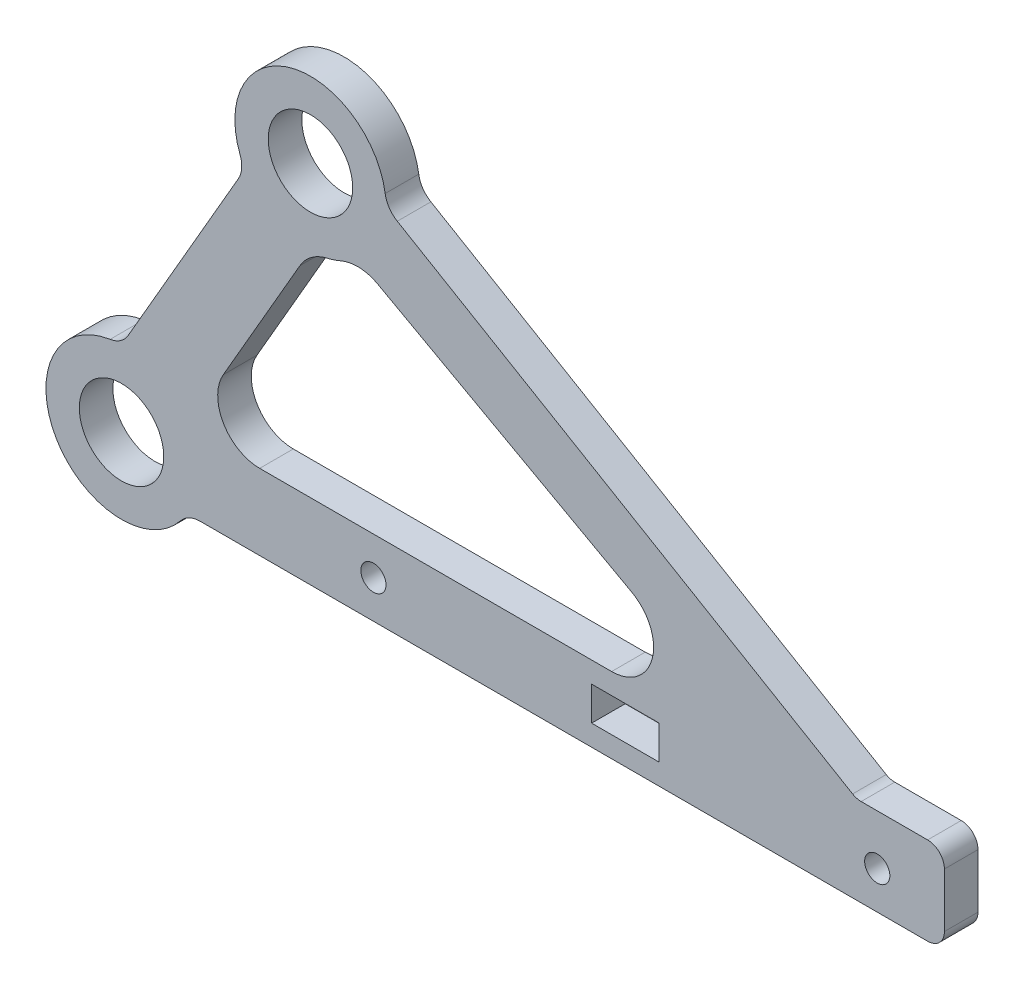
ISO-10303-21;
HEADER;
FILE_DESCRIPTION(('STEP AP214'),'2;1');
FILE_NAME('part.step','',(''),(''),'','','');
FILE_SCHEMA(('AUTOMOTIVE_DESIGN { 1 0 10303 214 1 1 1 1 }'));
ENDSEC;
DATA;
#1=APPLICATION_CONTEXT('core data for automotive mechanical design processes');
#2=APPLICATION_PROTOCOL_DEFINITION('international standard','automotive_design',2000,#1);
#3=PRODUCT_CONTEXT('',#1,'mechanical');
#4=PRODUCT('Part','Part','',(#3));
#5=PRODUCT_RELATED_PRODUCT_CATEGORY('part','',(#4));
#6=PRODUCT_DEFINITION_FORMATION('','',#4);
#7=PRODUCT_DEFINITION_CONTEXT('part definition',#1,'design');
#8=PRODUCT_DEFINITION('design','',#6,#7);
#9=PRODUCT_DEFINITION_SHAPE('','',#8);
#10=(LENGTH_UNIT() NAMED_UNIT(*) SI_UNIT(.MILLI.,.METRE.));
#11=(NAMED_UNIT(*) PLANE_ANGLE_UNIT() SI_UNIT($,.RADIAN.));
#12=(NAMED_UNIT(*) SI_UNIT($,.STERADIAN.) SOLID_ANGLE_UNIT());
#13=UNCERTAINTY_MEASURE_WITH_UNIT(LENGTH_MEASURE(1.E-05),#10,'distance_accuracy_value','');
#14=(GEOMETRIC_REPRESENTATION_CONTEXT(3) GLOBAL_UNCERTAINTY_ASSIGNED_CONTEXT((#13)) GLOBAL_UNIT_ASSIGNED_CONTEXT((#10,
#11,#12)) REPRESENTATION_CONTEXT('',''));
#15=CARTESIAN_POINT('',(0.,0.,0.));
#16=DIRECTION('',(0.,0.,1.));
#17=DIRECTION('',(1.,0.,0.));
#18=AXIS2_PLACEMENT_3D('',#15,#16,#17);
#19=CARTESIAN_POINT('',(96.0000000000011,-2.49999999999999,4.));
#20=DIRECTION('',(0.,0.,1.));
#21=DIRECTION('',(1.,0.,0.));
#22=AXIS2_PLACEMENT_3D('',#19,#20,#21);
#23=PLANE('',#22);
#24=CARTESIAN_POINT('',(90.0000000000011,0.,4.));
#25=DIRECTION('',(0.,0.,1.));
#26=DIRECTION('',(1.,0.,0.));
#27=AXIS2_PLACEMENT_3D('',#24,#25,#26);
#28=CIRCLE('',#27,1.5);
#29=CARTESIAN_POINT('',(91.5000000000011,0.,4.));
#30=VERTEX_POINT('',#29);
#31=EDGE_CURVE('E353',#30,#30,#28,.T.);
#32=ORIENTED_EDGE('',*,*,#31,.F.);
#33=EDGE_LOOP('',(#32));
#34=FACE_BOUND('',#33,.T.);
#35=CARTESIAN_POINT('',(0.,0.,4.));
#36=DIRECTION('',(0.,0.,1.));
#37=DIRECTION('',(1.,0.,0.));
#38=AXIS2_PLACEMENT_3D('',#35,#36,#37);
#39=CIRCLE('',#38,5.03);
#40=CARTESIAN_POINT('',(5.03,0.,4.));
#41=VERTEX_POINT('',#40);
#42=EDGE_CURVE('E369',#41,#41,#39,.T.);
#43=ORIENTED_EDGE('',*,*,#42,.F.);
#44=EDGE_LOOP('',(#43));
#45=FACE_BOUND('',#44,.T.);
#46=DIRECTION('',(0.,1.,0.));
#47=VECTOR('',#46,1.);
#48=CARTESIAN_POINT('',(98.0000000000011,3.95052900710355,4.));
#49=LINE('',#48,#47);
#50=CARTESIAN_POINT('',(98.0000000000011,-2.49999999999998,4.));
#51=VERTEX_POINT('',#50);
#52=CARTESIAN_POINT('',(98.0000000000011,3.95052900710355,4.));
#53=VERTEX_POINT('',#52);
#54=EDGE_CURVE('E377',#51,#53,#49,.T.);
#55=ORIENTED_EDGE('',*,*,#54,.T.);
#56=CARTESIAN_POINT('',(96.0000000000011,3.95052900710357,4.));
#57=DIRECTION('',(0.,0.,1.));
#58=DIRECTION('',(1.,0.,0.));
#59=AXIS2_PLACEMENT_3D('',#56,#57,#58);
#60=CIRCLE('',#59,2.);
#61=CARTESIAN_POINT('',(96.0000000000013,5.95052900710357,4.));
#62=VERTEX_POINT('',#61);
#63=EDGE_CURVE('E381',#53,#62,#60,.T.);
#64=ORIENTED_EDGE('',*,*,#63,.T.);
#65=DIRECTION('',(-1.,1.34987271563253E-13,0.));
#66=VECTOR('',#65,1.);
#67=CARTESIAN_POINT('',(88.0837746490726,5.95052900710463,4.));
#68=LINE('',#67,#66);
#69=CARTESIAN_POINT('',(88.0837746490726,5.95052900710467,4.));
#70=VERTEX_POINT('',#69);
#71=EDGE_CURVE('E385',#62,#70,#68,.T.);
#72=ORIENTED_EDGE('',*,*,#71,.T.);
#73=CARTESIAN_POINT('',(88.0837746490723,7.95052900710405,4.));
#74=DIRECTION('',(0.,0.,-1.));
#75=DIRECTION('',(1.,0.,0.));
#76=AXIS2_PLACEMENT_3D('',#73,#74,#75);
#77=CIRCLE('',#76,1.99999999999938);
#78=CARTESIAN_POINT('',(87.0684353143254,6.22742540159654,4.));
#79=VERTEX_POINT('',#78);
#80=EDGE_CURVE('E388',#70,#79,#77,.T.);
#81=ORIENTED_EDGE('',*,*,#80,.T.);
#82=DIRECTION('',(-0.86155180275405,0.507669667373625,0.));
#83=VECTOR('',#82,1.);
#84=CARTESIAN_POINT('',(32.8421642556363,38.1802724657858,4.));
#85=LINE('',#84,#83);
#86=CARTESIAN_POINT('',(32.8421642556363,38.1802724657858,4.));
#87=VERTEX_POINT('',#86);
#88=EDGE_CURVE('E391',#79,#87,#85,.T.);
#89=ORIENTED_EDGE('',*,*,#88,.T.);
#90=CARTESIAN_POINT('',(34.3651732577572,40.7649278740479,4.));
#91=DIRECTION('',(0.,0.,-1.));
#92=DIRECTION('',(-1.,0.,0.));
#93=AXIS2_PLACEMENT_3D('',#90,#91,#92);
#94=CIRCLE('',#93,3.00000000000002);
#95=CARTESIAN_POINT('',(31.3988799433178,40.3164816981109,4.));
#96=VERTEX_POINT('',#95);
#97=EDGE_CURVE('E394',#87,#96,#94,.T.);
#98=ORIENTED_EDGE('',*,*,#97,.T.);
#99=CARTESIAN_POINT('',(22.4999999999999,38.9711431702998,4.));
#100=DIRECTION('',(0.,0.,1.));
#101=DIRECTION('',(-1.,0.,0.));
#102=AXIS2_PLACEMENT_3D('',#99,#100,#101);
#103=CIRCLE('',#102,8.99999999999996);
#104=CARTESIAN_POINT('',(14.1157957296134,35.6992753929543,4.));
#105=VERTEX_POINT('',#104);
#106=EDGE_CURVE('E397',#96,#105,#103,.T.);
#107=ORIENTED_EDGE('',*,*,#106,.T.);
#108=CARTESIAN_POINT('',(11.3210609728179,34.6086528005058,4.));
#109=DIRECTION('',(0.,0.,-1.));
#110=DIRECTION('',(1.,0.,0.));
#111=AXIS2_PLACEMENT_3D('',#108,#109,#110);
#112=CIRCLE('',#111,3.);
#113=CARTESIAN_POINT('',(13.9191371841712,33.1086528005058,4.));
#114=VERTEX_POINT('',#113);
#115=EDGE_CURVE('E400',#105,#114,#112,.T.);
#116=ORIENTED_EDGE('',*,*,#115,.T.);
#117=DIRECTION('',(-0.499999999999998,-0.86602540378444,0.));
#118=VECTOR('',#117,1.);
#119=CARTESIAN_POINT('',(0.786634181768824,10.362490369794,4.));
#120=LINE('',#119,#118);
#121=CARTESIAN_POINT('',(0.786634181768823,10.362490369794,4.));
#122=VERTEX_POINT('',#121);
#123=EDGE_CURVE('E403',#114,#122,#120,.T.);
#124=ORIENTED_EDGE('',*,*,#123,.T.);
#125=CARTESIAN_POINT('',(-1.81144202958449,11.862490369794,4.));
#126=DIRECTION('',(0.,0.,-1.));
#127=DIRECTION('',(1.,0.,0.));
#128=AXIS2_PLACEMENT_3D('',#125,#126,#127);
#129=CIRCLE('',#128,2.99999999999999);
#130=CARTESIAN_POINT('',(-1.35858152218837,8.89686777734549,4.));
#131=VERTEX_POINT('',#130);
#132=EDGE_CURVE('E406',#122,#131,#129,.T.);
#133=ORIENTED_EDGE('',*,*,#132,.T.);
#134=CARTESIAN_POINT('',(0.,0.,4.));
#135=DIRECTION('',(0.,0.,1.));
#136=DIRECTION('',(1.,0.,0.));
#137=AXIS2_PLACEMENT_3D('',#134,#135,#136);
#138=CIRCLE('',#137,9.00000000000001);
#139=CARTESIAN_POINT('',(7.0256227481982,-5.625,4.));
#140=VERTEX_POINT('',#139);
#141=EDGE_CURVE('E409',#131,#140,#138,.T.);
#142=ORIENTED_EDGE('',*,*,#141,.T.);
#143=CARTESIAN_POINT('',(9.3674969975976,-7.5,4.));
#144=DIRECTION('',(0.,0.,-1.));
#145=DIRECTION('',(1.,0.,0.));
#146=AXIS2_PLACEMENT_3D('',#143,#144,#145);
#147=CIRCLE('',#146,3.);
#148=CARTESIAN_POINT('',(9.3674969975976,-4.5,4.));
#149=VERTEX_POINT('',#148);
#150=EDGE_CURVE('E412',#140,#149,#147,.T.);
#151=ORIENTED_EDGE('',*,*,#150,.T.);
#152=DIRECTION('',(1.,0.,0.));
#153=VECTOR('',#152,1.);
#154=CARTESIAN_POINT('',(87.0000000000011,-4.49999999999999,4.));
#155=LINE('',#154,#153);
#156=CARTESIAN_POINT('',(96.0000000000011,-4.5,4.));
#157=VERTEX_POINT('',#156);
#158=EDGE_CURVE('E415',#149,#157,#155,.T.);
#159=ORIENTED_EDGE('',*,*,#158,.T.);
#160=CARTESIAN_POINT('',(96.0000000000011,-2.49999999999999,4.));
#161=DIRECTION('',(0.,0.,1.));
#162=DIRECTION('',(1.,0.,0.));
#163=AXIS2_PLACEMENT_3D('',#160,#161,#162);
#164=CIRCLE('',#163,2.);
#165=EDGE_CURVE('E418',#157,#51,#164,.T.);
#166=ORIENTED_EDGE('',*,*,#165,.T.);
#167=EDGE_LOOP('',(#55,#64,#72,#81,#89,#98,#107,#116,#124,#133,#142,#151,#159,#166));
#168=FACE_BOUND('',#167,.T.);
#169=CARTESIAN_POINT('',(22.4999999999999,38.9711431702998,4.));
#170=DIRECTION('',(0.,0.,1.));
#171=DIRECTION('',(1.,0.,0.));
#172=AXIS2_PLACEMENT_3D('',#169,#170,#171);
#173=CIRCLE('',#172,5.02999999999998);
#174=CARTESIAN_POINT('',(27.5299999999999,38.9711431702998,4.));
#175=VERTEX_POINT('',#174);
#176=EDGE_CURVE('E361',#175,#175,#173,.T.);
#177=ORIENTED_EDGE('',*,*,#176,.F.);
#178=EDGE_LOOP('',(#177));
#179=FACE_BOUND('',#178,.T.);
#180=CARTESIAN_POINT('',(30.,0.,4.));
#181=DIRECTION('',(0.,0.,1.));
#182=DIRECTION('',(1.,0.,0.));
#183=AXIS2_PLACEMENT_3D('',#180,#181,#182);
#184=CIRCLE('',#183,1.5);
#185=CARTESIAN_POINT('',(31.5,0.,4.));
#186=VERTEX_POINT('',#185);
#187=EDGE_CURVE('E345',#186,#186,#184,.T.);
#188=ORIENTED_EDGE('',*,*,#187,.F.);
#189=EDGE_LOOP('',(#188));
#190=FACE_BOUND('',#189,.T.);
#191=DIRECTION('',(-1.,0.,0.));
#192=VECTOR('',#191,1.);
#193=CARTESIAN_POINT('',(55.985,2.015,4.));
#194=LINE('',#193,#192);
#195=CARTESIAN_POINT('',(64.015,2.015,4.));
#196=VERTEX_POINT('',#195);
#197=CARTESIAN_POINT('',(55.985,2.015,4.));
#198=VERTEX_POINT('',#197);
#199=EDGE_CURVE('E305',#196,#198,#194,.T.);
#200=ORIENTED_EDGE('',*,*,#199,.F.);
#201=DIRECTION('',(0.,1.,0.));
#202=VECTOR('',#201,1.);
#203=CARTESIAN_POINT('',(64.015,2.015,4.));
#204=LINE('',#203,#202);
#205=CARTESIAN_POINT('',(64.015,-2.01500000000001,4.));
#206=VERTEX_POINT('',#205);
#207=EDGE_CURVE('E302',#206,#196,#204,.T.);
#208=ORIENTED_EDGE('',*,*,#207,.F.);
#209=DIRECTION('',(1.,0.,0.));
#210=VECTOR('',#209,1.);
#211=CARTESIAN_POINT('',(55.985,-2.01500000000001,4.));
#212=LINE('',#211,#210);
#213=CARTESIAN_POINT('',(55.985,-2.01500000000001,4.));
#214=VERTEX_POINT('',#213);
#215=EDGE_CURVE('E313',#214,#206,#212,.T.);
#216=ORIENTED_EDGE('',*,*,#215,.F.);
#217=DIRECTION('',(0.,-1.,0.));
#218=VECTOR('',#217,1.);
#219=CARTESIAN_POINT('',(55.985,2.015,4.));
#220=LINE('',#219,#218);
#221=EDGE_CURVE('E309',#198,#214,#220,.T.);
#222=ORIENTED_EDGE('',*,*,#221,.F.);
#223=EDGE_LOOP('',(#200,#208,#216,#222));
#224=FACE_BOUND('',#223,.T.);
#225=DIRECTION('',(-0.876161296133135,0.482018031984598,0.));
#226=VECTOR('',#225,1.);
#227=CARTESIAN_POINT('',(30.5218860724274,30.5258923208114,4.));
#228=LINE('',#227,#226);
#229=CARTESIAN_POINT('',(60.7775591307648,13.8808064806658,4.));
#230=VERTEX_POINT('',#229);
#231=CARTESIAN_POINT('',(30.5218860724274,30.5258923208114,4.));
#232=VERTEX_POINT('',#231);
#233=EDGE_CURVE('E222',#230,#232,#228,.T.);
#234=ORIENTED_EDGE('',*,*,#233,.F.);
#235=CARTESIAN_POINT('',(58.3674689708418,9.50000000000011,4.));
#236=DIRECTION('',(0.,0.,1.));
#237=DIRECTION('',(1.,0.,0.));
#238=AXIS2_PLACEMENT_3D('',#235,#236,#237);
#239=CIRCLE('',#238,5.00000000000002);
#240=CARTESIAN_POINT('',(58.3674689708415,4.50000000000011,4.));
#241=VERTEX_POINT('',#240);
#242=EDGE_CURVE('E213',#241,#230,#239,.T.);
#243=ORIENTED_EDGE('',*,*,#242,.F.);
#244=DIRECTION('',(1.,0.,0.));
#245=VECTOR('',#244,1.);
#246=CARTESIAN_POINT('',(16.4544826719044,4.50000000000002,4.));
#247=LINE('',#246,#245);
#248=CARTESIAN_POINT('',(16.4544826719044,4.50000000000002,4.));
#249=VERTEX_POINT('',#248);
#250=EDGE_CURVE('E254',#249,#241,#247,.T.);
#251=ORIENTED_EDGE('',*,*,#250,.F.);
#252=CARTESIAN_POINT('',(16.4544826719043,9.50000000000002,4.));
#253=DIRECTION('',(0.,0.,1.));
#254=DIRECTION('',(1.,0.,0.));
#255=AXIS2_PLACEMENT_3D('',#252,#253,#254);
#256=CIRCLE('',#255,5.);
#257=CARTESIAN_POINT('',(12.1243556529821,12.0000000000001,4.));
#258=VERTEX_POINT('',#257);
#259=EDGE_CURVE('E251',#258,#249,#256,.T.);
#260=ORIENTED_EDGE('',*,*,#259,.F.);
#261=DIRECTION('',(-0.499999999999997,-0.86602540378444,0.));
#262=VECTOR('',#261,1.);
#263=CARTESIAN_POINT('',(21.2553733667291,27.8153866050214,4.));
#264=LINE('',#263,#262);
#265=CARTESIAN_POINT('',(21.2553733667291,27.8153866050214,4.));
#266=VERTEX_POINT('',#265);
#267=EDGE_CURVE('E248',#266,#258,#264,.T.);
#268=ORIENTED_EDGE('',*,*,#267,.F.);
#269=CARTESIAN_POINT('',(25.5855003856513,25.3153866050214,4.));
#270=DIRECTION('',(0.,0.,1.));
#271=DIRECTION('',(1.,0.,0.));
#272=AXIS2_PLACEMENT_3D('',#269,#270,#271);
#273=CIRCLE('',#272,5.);
#274=CARTESIAN_POINT('',(24.4835359622044,30.1924425211923,4.));
#275=VERTEX_POINT('',#274);
#276=EDGE_CURVE('E245',#275,#266,#273,.T.);
#277=ORIENTED_EDGE('',*,*,#276,.F.);
#278=CARTESIAN_POINT('',(22.4999999999996,38.9711431703006,4.));
#279=DIRECTION('',(0.,0.,-1.));
#280=DIRECTION('',(1.,0.,0.));
#281=AXIS2_PLACEMENT_3D('',#278,#279,#280);
#282=CIRCLE('',#281,9.0000000000009);
#283=CARTESIAN_POINT('',(26.1075830866103,30.7258206009152,4.));
#284=VERTEX_POINT('',#283);
#285=EDGE_CURVE('E240',#284,#275,#282,.T.);
#286=ORIENTED_EDGE('',*,*,#285,.F.);
#287=CARTESIAN_POINT('',(28.1117959125044,26.1450858401456,4.));
#288=DIRECTION('',(0.,0.,1.));
#289=DIRECTION('',(1.,0.,0.));
#290=AXIS2_PLACEMENT_3D('',#287,#288,#289);
#291=CIRCLE('',#290,5.00000000000006);
#292=EDGE_CURVE('E236',#232,#284,#291,.T.);
#293=ORIENTED_EDGE('',*,*,#292,.F.);
#294=EDGE_LOOP('',(#234,#243,#251,#260,#268,#277,#286,#293));
#295=FACE_BOUND('',#294,.T.);
#296=ADVANCED_FACE('F39',(#34,#45,#168,#179,#190,#224,#295),#23,.T.);
#297=CARTESIAN_POINT('',(96.0000000000011,-2.49999999999999,0.));
#298=DIRECTION('',(0.,0.,1.));
#299=DIRECTION('',(1.,0.,0.));
#300=AXIS2_PLACEMENT_3D('',#297,#298,#299);
#301=PLANE('',#300);
#302=DIRECTION('',(0.,1.,0.));
#303=VECTOR('',#302,1.);
#304=CARTESIAN_POINT('',(64.015,2.015,0.));
#305=LINE('',#304,#303);
#306=CARTESIAN_POINT('',(64.015,-2.01500000000001,0.));
#307=VERTEX_POINT('',#306);
#308=CARTESIAN_POINT('',(64.015,2.015,0.));
#309=VERTEX_POINT('',#308);
#310=EDGE_CURVE('E231',#307,#309,#305,.T.);
#311=ORIENTED_EDGE('',*,*,#310,.T.);
#312=DIRECTION('',(-1.,0.,0.));
#313=VECTOR('',#312,1.);
#314=CARTESIAN_POINT('',(55.985,2.015,0.));
#315=LINE('',#314,#313);
#316=CARTESIAN_POINT('',(55.985,2.015,0.));
#317=VERTEX_POINT('',#316);
#318=EDGE_CURVE('E320',#309,#317,#315,.T.);
#319=ORIENTED_EDGE('',*,*,#318,.T.);
#320=DIRECTION('',(0.,-1.,0.));
#321=VECTOR('',#320,1.);
#322=CARTESIAN_POINT('',(55.985,2.015,0.));
#323=LINE('',#322,#321);
#324=CARTESIAN_POINT('',(55.985,-2.01500000000001,0.));
#325=VERTEX_POINT('',#324);
#326=EDGE_CURVE('E324',#317,#325,#323,.T.);
#327=ORIENTED_EDGE('',*,*,#326,.T.);
#328=DIRECTION('',(1.,0.,0.));
#329=VECTOR('',#328,1.);
#330=CARTESIAN_POINT('',(55.985,-2.01500000000001,0.));
#331=LINE('',#330,#329);
#332=EDGE_CURVE('E306',#325,#307,#331,.T.);
#333=ORIENTED_EDGE('',*,*,#332,.T.);
#334=EDGE_LOOP('',(#311,#319,#327,#333));
#335=FACE_BOUND('',#334,.T.);
#336=CARTESIAN_POINT('',(96.0000000000011,3.95052900710357,0.));
#337=DIRECTION('',(0.,0.,1.));
#338=DIRECTION('',(1.,0.,0.));
#339=AXIS2_PLACEMENT_3D('',#336,#337,#338);
#340=CIRCLE('',#339,2.);
#341=CARTESIAN_POINT('',(98.0000000000011,3.95052900710355,0.));
#342=VERTEX_POINT('',#341);
#343=CARTESIAN_POINT('',(96.0000000000013,5.95052900710357,0.));
#344=VERTEX_POINT('',#343);
#345=EDGE_CURVE('E373',#342,#344,#340,.T.);
#346=ORIENTED_EDGE('',*,*,#345,.F.);
#347=DIRECTION('',(0.,1.,0.));
#348=VECTOR('',#347,1.);
#349=CARTESIAN_POINT('',(98.0000000000011,0.,0.));
#350=LINE('',#349,#348);
#351=CARTESIAN_POINT('',(98.0000000000011,-2.49999999999998,0.));
#352=VERTEX_POINT('',#351);
#353=EDGE_CURVE('E382',#352,#342,#350,.T.);
#354=ORIENTED_EDGE('',*,*,#353,.F.);
#355=CARTESIAN_POINT('',(96.0000000000011,-2.49999999999999,0.));
#356=DIRECTION('',(0.,0.,1.));
#357=DIRECTION('',(1.,0.,0.));
#358=AXIS2_PLACEMENT_3D('',#355,#356,#357);
#359=CIRCLE('',#358,2.);
#360=CARTESIAN_POINT('',(96.0000000000011,-4.5,0.));
#361=VERTEX_POINT('',#360);
#362=EDGE_CURVE('E459',#361,#352,#359,.T.);
#363=ORIENTED_EDGE('',*,*,#362,.F.);
#364=DIRECTION('',(1.,0.,0.));
#365=VECTOR('',#364,1.);
#366=CARTESIAN_POINT('',(96.0000000000011,-4.49999999999999,0.));
#367=LINE('',#366,#365);
#368=CARTESIAN_POINT('',(9.3674969975976,-4.5,0.));
#369=VERTEX_POINT('',#368);
#370=EDGE_CURVE('E456',#369,#361,#367,.T.);
#371=ORIENTED_EDGE('',*,*,#370,.F.);
#372=CARTESIAN_POINT('',(9.3674969975976,-7.5,0.));
#373=DIRECTION('',(0.,0.,-1.));
#374=DIRECTION('',(1.,0.,0.));
#375=AXIS2_PLACEMENT_3D('',#372,#373,#374);
#376=CIRCLE('',#375,3.);
#377=CARTESIAN_POINT('',(7.0256227481982,-5.625,0.));
#378=VERTEX_POINT('',#377);
#379=EDGE_CURVE('E452',#378,#369,#376,.T.);
#380=ORIENTED_EDGE('',*,*,#379,.F.);
#381=CARTESIAN_POINT('',(0.,0.,0.));
#382=DIRECTION('',(0.,0.,1.));
#383=DIRECTION('',(1.,0.,0.));
#384=AXIS2_PLACEMENT_3D('',#381,#382,#383);
#385=CIRCLE('',#384,9.00000000000001);
#386=CARTESIAN_POINT('',(-1.35858152218837,8.89686777734549,0.));
#387=VERTEX_POINT('',#386);
#388=EDGE_CURVE('E449',#387,#378,#385,.T.);
#389=ORIENTED_EDGE('',*,*,#388,.F.);
#390=CARTESIAN_POINT('',(-1.81144202958449,11.862490369794,0.));
#391=DIRECTION('',(0.,0.,-1.));
#392=DIRECTION('',(1.,0.,0.));
#393=AXIS2_PLACEMENT_3D('',#390,#391,#392);
#394=CIRCLE('',#393,2.99999999999999);
#395=CARTESIAN_POINT('',(0.786634181768823,10.362490369794,0.));
#396=VERTEX_POINT('',#395);
#397=EDGE_CURVE('E446',#396,#387,#394,.T.);
#398=ORIENTED_EDGE('',*,*,#397,.F.);
#399=DIRECTION('',(-0.499999999999998,-0.86602540378444,0.));
#400=VECTOR('',#399,1.);
#401=CARTESIAN_POINT('',(0.786634181768824,10.362490369794,0.));
#402=LINE('',#401,#400);
#403=CARTESIAN_POINT('',(13.9191371841712,33.1086528005058,0.));
#404=VERTEX_POINT('',#403);
#405=EDGE_CURVE('E443',#404,#396,#402,.T.);
#406=ORIENTED_EDGE('',*,*,#405,.F.);
#407=CARTESIAN_POINT('',(11.3210609728179,34.6086528005058,0.));
#408=DIRECTION('',(0.,0.,-1.));
#409=DIRECTION('',(1.,0.,0.));
#410=AXIS2_PLACEMENT_3D('',#407,#408,#409);
#411=CIRCLE('',#410,3.);
#412=CARTESIAN_POINT('',(14.1157957296134,35.6992753929543,0.));
#413=VERTEX_POINT('',#412);
#414=EDGE_CURVE('E440',#413,#404,#411,.T.);
#415=ORIENTED_EDGE('',*,*,#414,.F.);
#416=CARTESIAN_POINT('',(22.4999999999999,38.9711431702998,0.));
#417=DIRECTION('',(0.,0.,1.));
#418=DIRECTION('',(-1.,0.,0.));
#419=AXIS2_PLACEMENT_3D('',#416,#417,#418);
#420=CIRCLE('',#419,8.99999999999996);
#421=CARTESIAN_POINT('',(31.3988799433178,40.3164816981109,0.));
#422=VERTEX_POINT('',#421);
#423=EDGE_CURVE('E437',#422,#413,#420,.T.);
#424=ORIENTED_EDGE('',*,*,#423,.F.);
#425=CARTESIAN_POINT('',(34.3651732577572,40.7649278740479,0.));
#426=DIRECTION('',(0.,0.,-1.));
#427=DIRECTION('',(-1.,0.,0.));
#428=AXIS2_PLACEMENT_3D('',#425,#426,#427);
#429=CIRCLE('',#428,3.00000000000002);
#430=CARTESIAN_POINT('',(32.8421642556363,38.1802724657858,0.));
#431=VERTEX_POINT('',#430);
#432=EDGE_CURVE('E434',#431,#422,#429,.T.);
#433=ORIENTED_EDGE('',*,*,#432,.F.);
#434=DIRECTION('',(-0.86155180275405,0.507669667373625,0.));
#435=VECTOR('',#434,1.);
#436=CARTESIAN_POINT('',(32.8421642556363,38.1802724657858,0.));
#437=LINE('',#436,#435);
#438=CARTESIAN_POINT('',(87.0684353143254,6.22742540159654,0.));
#439=VERTEX_POINT('',#438);
#440=EDGE_CURVE('E431',#439,#431,#437,.T.);
#441=ORIENTED_EDGE('',*,*,#440,.F.);
#442=CARTESIAN_POINT('',(88.0837746490723,7.95052900710405,0.));
#443=DIRECTION('',(0.,0.,-1.));
#444=DIRECTION('',(1.,0.,0.));
#445=AXIS2_PLACEMENT_3D('',#442,#443,#444);
#446=CIRCLE('',#445,1.99999999999938);
#447=CARTESIAN_POINT('',(88.0837746490726,5.95052900710467,0.));
#448=VERTEX_POINT('',#447);
#449=EDGE_CURVE('E428',#448,#439,#446,.T.);
#450=ORIENTED_EDGE('',*,*,#449,.F.);
#451=DIRECTION('',(-1.,1.34987271563253E-13,0.));
#452=VECTOR('',#451,1.);
#453=CARTESIAN_POINT('',(88.0837746490726,5.95052900710463,0.));
#454=LINE('',#453,#452);
#455=EDGE_CURVE('E425',#344,#448,#454,.T.);
#456=ORIENTED_EDGE('',*,*,#455,.F.);
#457=EDGE_LOOP('',(#346,#354,#363,#371,#380,#389,#398,#406,#415,#424,#433,#441,#450,#456));
#458=FACE_BOUND('',#457,.T.);
#459=CARTESIAN_POINT('',(0.,0.,0.));
#460=DIRECTION('',(0.,0.,1.));
#461=DIRECTION('',(1.,0.,0.));
#462=AXIS2_PLACEMENT_3D('',#459,#460,#461);
#463=CIRCLE('',#462,5.03);
#464=CARTESIAN_POINT('',(5.03,0.,0.));
#465=VERTEX_POINT('',#464);
#466=EDGE_CURVE('E365',#465,#465,#463,.T.);
#467=ORIENTED_EDGE('',*,*,#466,.T.);
#468=EDGE_LOOP('',(#467));
#469=FACE_BOUND('',#468,.T.);
#470=CARTESIAN_POINT('',(22.4999999999999,38.9711431702998,0.));
#471=DIRECTION('',(0.,0.,1.));
#472=DIRECTION('',(1.,0.,0.));
#473=AXIS2_PLACEMENT_3D('',#470,#471,#472);
#474=CIRCLE('',#473,5.02999999999998);
#475=CARTESIAN_POINT('',(27.5299999999999,38.9711431702998,0.));
#476=VERTEX_POINT('',#475);
#477=EDGE_CURVE('E357',#476,#476,#474,.T.);
#478=ORIENTED_EDGE('',*,*,#477,.T.);
#479=EDGE_LOOP('',(#478));
#480=FACE_BOUND('',#479,.T.);
#481=CARTESIAN_POINT('',(90.0000000000011,0.,0.));
#482=DIRECTION('',(0.,0.,1.));
#483=DIRECTION('',(1.,0.,0.));
#484=AXIS2_PLACEMENT_3D('',#481,#482,#483);
#485=CIRCLE('',#484,1.5);
#486=CARTESIAN_POINT('',(91.5000000000011,0.,0.));
#487=VERTEX_POINT('',#486);
#488=EDGE_CURVE('E349',#487,#487,#485,.T.);
#489=ORIENTED_EDGE('',*,*,#488,.T.);
#490=EDGE_LOOP('',(#489));
#491=FACE_BOUND('',#490,.T.);
#492=CARTESIAN_POINT('',(30.,0.,0.));
#493=DIRECTION('',(0.,0.,1.));
#494=DIRECTION('',(1.,0.,0.));
#495=AXIS2_PLACEMENT_3D('',#492,#493,#494);
#496=CIRCLE('',#495,1.5);
#497=CARTESIAN_POINT('',(31.5,0.,0.));
#498=VERTEX_POINT('',#497);
#499=EDGE_CURVE('E344',#498,#498,#496,.T.);
#500=ORIENTED_EDGE('',*,*,#499,.T.);
#501=EDGE_LOOP('',(#500));
#502=FACE_BOUND('',#501,.T.);
#503=CARTESIAN_POINT('',(58.3674689708418,9.50000000000011,0.));
#504=DIRECTION('',(0.,0.,1.));
#505=DIRECTION('',(1.,0.,0.));
#506=AXIS2_PLACEMENT_3D('',#503,#504,#505);
#507=CIRCLE('',#506,5.00000000000002);
#508=CARTESIAN_POINT('',(58.3674689708415,4.50000000000011,0.));
#509=VERTEX_POINT('',#508);
#510=CARTESIAN_POINT('',(60.7775591307648,13.8808064806658,0.));
#511=VERTEX_POINT('',#510);
#512=EDGE_CURVE('E63',#509,#511,#507,.T.);
#513=ORIENTED_EDGE('',*,*,#512,.T.);
#514=DIRECTION('',(-0.876161296133135,0.482018031984598,0.));
#515=VECTOR('',#514,1.);
#516=CARTESIAN_POINT('',(30.5218860724274,30.5258923208114,0.));
#517=LINE('',#516,#515);
#518=CARTESIAN_POINT('',(30.5218860724274,30.5258923208114,0.));
#519=VERTEX_POINT('',#518);
#520=EDGE_CURVE('E229',#511,#519,#517,.T.);
#521=ORIENTED_EDGE('',*,*,#520,.T.);
#522=CARTESIAN_POINT('',(28.1117959125044,26.1450858401456,0.));
#523=DIRECTION('',(0.,0.,1.));
#524=DIRECTION('',(1.,0.,0.));
#525=AXIS2_PLACEMENT_3D('',#522,#523,#524);
#526=CIRCLE('',#525,5.00000000000006);
#527=CARTESIAN_POINT('',(26.1075830866103,30.7258206009152,0.));
#528=VERTEX_POINT('',#527);
#529=EDGE_CURVE('E261',#519,#528,#526,.T.);
#530=ORIENTED_EDGE('',*,*,#529,.T.);
#531=CARTESIAN_POINT('',(22.4999999999996,38.9711431703006,0.));
#532=DIRECTION('',(0.,0.,-1.));
#533=DIRECTION('',(1.,0.,0.));
#534=AXIS2_PLACEMENT_3D('',#531,#532,#533);
#535=CIRCLE('',#534,9.0000000000009);
#536=CARTESIAN_POINT('',(24.4835359622044,30.1924425211923,0.));
#537=VERTEX_POINT('',#536);
#538=EDGE_CURVE('E265',#528,#537,#535,.T.);
#539=ORIENTED_EDGE('',*,*,#538,.T.);
#540=CARTESIAN_POINT('',(25.5855003856513,25.3153866050214,0.));
#541=DIRECTION('',(0.,0.,1.));
#542=DIRECTION('',(1.,0.,0.));
#543=AXIS2_PLACEMENT_3D('',#540,#541,#542);
#544=CIRCLE('',#543,5.);
#545=CARTESIAN_POINT('',(21.2553733667291,27.8153866050214,0.));
#546=VERTEX_POINT('',#545);
#547=EDGE_CURVE('E269',#537,#546,#544,.T.);
#548=ORIENTED_EDGE('',*,*,#547,.T.);
#549=DIRECTION('',(-0.499999999999997,-0.86602540378444,0.));
#550=VECTOR('',#549,1.);
#551=CARTESIAN_POINT('',(21.2553733667291,27.8153866050214,0.));
#552=LINE('',#551,#550);
#553=CARTESIAN_POINT('',(12.1243556529821,12.0000000000001,0.));
#554=VERTEX_POINT('',#553);
#555=EDGE_CURVE('E273',#546,#554,#552,.T.);
#556=ORIENTED_EDGE('',*,*,#555,.T.);
#557=CARTESIAN_POINT('',(16.4544826719043,9.50000000000002,0.));
#558=DIRECTION('',(0.,0.,1.));
#559=DIRECTION('',(1.,0.,0.));
#560=AXIS2_PLACEMENT_3D('',#557,#558,#559);
#561=CIRCLE('',#560,5.);
#562=CARTESIAN_POINT('',(16.4544826719044,4.50000000000002,0.));
#563=VERTEX_POINT('',#562);
#564=EDGE_CURVE('E277',#554,#563,#561,.T.);
#565=ORIENTED_EDGE('',*,*,#564,.T.);
#566=DIRECTION('',(1.,0.,0.));
#567=VECTOR('',#566,1.);
#568=CARTESIAN_POINT('',(16.4544826719044,4.50000000000002,0.));
#569=LINE('',#568,#567);
#570=EDGE_CURVE('E223',#563,#509,#569,.T.);
#571=ORIENTED_EDGE('',*,*,#570,.T.);
#572=EDGE_LOOP('',(#513,#521,#530,#539,#548,#556,#565,#571));
#573=FACE_BOUND('',#572,.T.);
#574=ADVANCED_FACE('F522',(#335,#458,#469,#480,#491,#502,#573),#301,.F.);
#575=CARTESIAN_POINT('',(96.0000000000011,3.95052900710357,4.));
#576=DIRECTION('',(0.,0.,-1.));
#577=DIRECTION('',(-1.,0.,0.));
#578=AXIS2_PLACEMENT_3D('',#575,#576,#577);
#579=CYLINDRICAL_SURFACE('',#578,2.);
#580=ORIENTED_EDGE('',*,*,#345,.T.);
#581=DIRECTION('',(0.,0.,-1.));
#582=VECTOR('',#581,1.);
#583=CARTESIAN_POINT('',(96.0000000000013,5.95052900710357,4.));
#584=LINE('',#583,#582);
#585=EDGE_CURVE('E48',#62,#344,#584,.T.);
#586=ORIENTED_EDGE('',*,*,#585,.F.);
#587=ORIENTED_EDGE('',*,*,#63,.F.);
#588=DIRECTION('',(0.,0.,-1.));
#589=VECTOR('',#588,1.);
#590=CARTESIAN_POINT('',(98.0000000000011,3.95052900710355,4.));
#591=LINE('',#590,#589);
#592=EDGE_CURVE('E11',#53,#342,#591,.T.);
#593=ORIENTED_EDGE('',*,*,#592,.T.);
#594=EDGE_LOOP('',(#580,#586,#587,#593));
#595=FACE_BOUND('',#594,.T.);
#596=ADVANCED_FACE('F41',(#595),#579,.T.);
#597=CARTESIAN_POINT('',(88.0837746490726,5.95052900710463,4.));
#598=DIRECTION('',(-1.34987271563253E-13,-1.,0.));
#599=DIRECTION('',(1.,-1.34987271563253E-13,0.));
#600=AXIS2_PLACEMENT_3D('',#597,#598,#599);
#601=PLANE('',#600);
#602=ORIENTED_EDGE('',*,*,#455,.T.);
#603=DIRECTION('',(0.,0.,-1.));
#604=VECTOR('',#603,1.);
#605=CARTESIAN_POINT('',(88.0837746490726,5.95052900710467,4.));
#606=LINE('',#605,#604);
#607=EDGE_CURVE('E507',#70,#448,#606,.T.);
#608=ORIENTED_EDGE('',*,*,#607,.F.);
#609=ORIENTED_EDGE('',*,*,#71,.F.);
#610=ORIENTED_EDGE('',*,*,#585,.T.);
#611=EDGE_LOOP('',(#602,#608,#609,#610));
#612=FACE_BOUND('',#611,.T.);
#613=ADVANCED_FACE('F516',(#612),#601,.F.);
#614=CARTESIAN_POINT('',(88.0837746490723,7.95052900710405,4.));
#615=DIRECTION('',(0.,0.,-1.));
#616=DIRECTION('',(-1.,0.,0.));
#617=AXIS2_PLACEMENT_3D('',#614,#615,#616);
#618=CYLINDRICAL_SURFACE('',#617,1.99999999999938);
#619=ORIENTED_EDGE('',*,*,#449,.T.);
#620=DIRECTION('',(0.,0.,-1.));
#621=VECTOR('',#620,1.);
#622=CARTESIAN_POINT('',(87.0684353143254,6.22742540159654,4.));
#623=LINE('',#622,#621);
#624=EDGE_CURVE('E503',#79,#439,#623,.T.);
#625=ORIENTED_EDGE('',*,*,#624,.F.);
#626=ORIENTED_EDGE('',*,*,#80,.F.);
#627=ORIENTED_EDGE('',*,*,#607,.T.);
#628=EDGE_LOOP('',(#619,#625,#626,#627));
#629=FACE_BOUND('',#628,.T.);
#630=ADVANCED_FACE('F529',(#629),#618,.F.);
#631=CARTESIAN_POINT('',(32.8421642556363,38.1802724657858,4.));
#632=DIRECTION('',(-0.507669667373625,-0.86155180275405,0.));
#633=DIRECTION('',(0.86155180275405,-0.507669667373625,0.));
#634=AXIS2_PLACEMENT_3D('',#631,#632,#633);
#635=PLANE('',#634);
#636=ORIENTED_EDGE('',*,*,#440,.T.);
#637=DIRECTION('',(0.,0.,-1.));
#638=VECTOR('',#637,1.);
#639=CARTESIAN_POINT('',(32.8421642556363,38.1802724657858,4.));
#640=LINE('',#639,#638);
#641=EDGE_CURVE('E499',#87,#431,#640,.T.);
#642=ORIENTED_EDGE('',*,*,#641,.F.);
#643=ORIENTED_EDGE('',*,*,#88,.F.);
#644=ORIENTED_EDGE('',*,*,#624,.T.);
#645=EDGE_LOOP('',(#636,#642,#643,#644));
#646=FACE_BOUND('',#645,.T.);
#647=ADVANCED_FACE('F533',(#646),#635,.F.);
#648=CARTESIAN_POINT('',(34.3651732577572,40.7649278740479,4.));
#649=DIRECTION('',(0.,0.,-1.));
#650=DIRECTION('',(-1.,0.,0.));
#651=AXIS2_PLACEMENT_3D('',#648,#649,#650);
#652=CYLINDRICAL_SURFACE('',#651,3.00000000000002);
#653=ORIENTED_EDGE('',*,*,#432,.T.);
#654=DIRECTION('',(0.,0.,-1.));
#655=VECTOR('',#654,1.);
#656=CARTESIAN_POINT('',(31.3988799433178,40.3164816981109,4.));
#657=LINE('',#656,#655);
#658=EDGE_CURVE('E495',#96,#422,#657,.T.);
#659=ORIENTED_EDGE('',*,*,#658,.F.);
#660=ORIENTED_EDGE('',*,*,#97,.F.);
#661=ORIENTED_EDGE('',*,*,#641,.T.);
#662=EDGE_LOOP('',(#653,#659,#660,#661));
#663=FACE_BOUND('',#662,.T.);
#664=ADVANCED_FACE('F582',(#663),#652,.F.);
#665=CARTESIAN_POINT('',(22.4999999999999,38.9711431702998,4.));
#666=DIRECTION('',(0.,0.,-1.));
#667=DIRECTION('',(-1.,0.,0.));
#668=AXIS2_PLACEMENT_3D('',#665,#666,#667);
#669=CYLINDRICAL_SURFACE('',#668,8.99999999999996);
#670=ORIENTED_EDGE('',*,*,#423,.T.);
#671=DIRECTION('',(0.,0.,-1.));
#672=VECTOR('',#671,1.);
#673=CARTESIAN_POINT('',(14.1157957296134,35.6992753929543,4.));
#674=LINE('',#673,#672);
#675=EDGE_CURVE('E491',#105,#413,#674,.T.);
#676=ORIENTED_EDGE('',*,*,#675,.F.);
#677=ORIENTED_EDGE('',*,*,#106,.F.);
#678=ORIENTED_EDGE('',*,*,#658,.T.);
#679=EDGE_LOOP('',(#670,#676,#677,#678));
#680=FACE_BOUND('',#679,.T.);
#681=ADVANCED_FACE('F580',(#680),#669,.T.);
#682=CARTESIAN_POINT('',(11.3210609728179,34.6086528005058,4.));
#683=DIRECTION('',(0.,0.,-1.));
#684=DIRECTION('',(-1.,0.,0.));
#685=AXIS2_PLACEMENT_3D('',#682,#683,#684);
#686=CYLINDRICAL_SURFACE('',#685,3.);
#687=ORIENTED_EDGE('',*,*,#414,.T.);
#688=DIRECTION('',(0.,0.,-1.));
#689=VECTOR('',#688,1.);
#690=CARTESIAN_POINT('',(13.9191371841712,33.1086528005058,4.));
#691=LINE('',#690,#689);
#692=EDGE_CURVE('E487',#114,#404,#691,.T.);
#693=ORIENTED_EDGE('',*,*,#692,.F.);
#694=ORIENTED_EDGE('',*,*,#115,.F.);
#695=ORIENTED_EDGE('',*,*,#675,.T.);
#696=EDGE_LOOP('',(#687,#693,#694,#695));
#697=FACE_BOUND('',#696,.T.);
#698=ADVANCED_FACE('F575',(#697),#686,.F.);
#699=CARTESIAN_POINT('',(0.786634181768824,10.362490369794,4.));
#700=DIRECTION('',(0.86602540378444,-0.499999999999998,0.));
#701=DIRECTION('',(0.499999999999998,0.86602540378444,0.));
#702=AXIS2_PLACEMENT_3D('',#699,#700,#701);
#703=PLANE('',#702);
#704=ORIENTED_EDGE('',*,*,#405,.T.);
#705=DIRECTION('',(0.,0.,-1.));
#706=VECTOR('',#705,1.);
#707=CARTESIAN_POINT('',(0.786634181768823,10.362490369794,4.));
#708=LINE('',#707,#706);
#709=EDGE_CURVE('E483',#122,#396,#708,.T.);
#710=ORIENTED_EDGE('',*,*,#709,.F.);
#711=ORIENTED_EDGE('',*,*,#123,.F.);
#712=ORIENTED_EDGE('',*,*,#692,.T.);
#713=EDGE_LOOP('',(#704,#710,#711,#712));
#714=FACE_BOUND('',#713,.T.);
#715=ADVANCED_FACE('F570',(#714),#703,.F.);
#716=CARTESIAN_POINT('',(-1.81144202958449,11.862490369794,4.));
#717=DIRECTION('',(0.,0.,-1.));
#718=DIRECTION('',(-1.,0.,0.));
#719=AXIS2_PLACEMENT_3D('',#716,#717,#718);
#720=CYLINDRICAL_SURFACE('',#719,2.99999999999999);
#721=ORIENTED_EDGE('',*,*,#397,.T.);
#722=DIRECTION('',(0.,0.,-1.));
#723=VECTOR('',#722,1.);
#724=CARTESIAN_POINT('',(-1.35858152218837,8.89686777734549,4.));
#725=LINE('',#724,#723);
#726=EDGE_CURVE('E479',#131,#387,#725,.T.);
#727=ORIENTED_EDGE('',*,*,#726,.F.);
#728=ORIENTED_EDGE('',*,*,#132,.F.);
#729=ORIENTED_EDGE('',*,*,#709,.T.);
#730=EDGE_LOOP('',(#721,#727,#728,#729));
#731=FACE_BOUND('',#730,.T.);
#732=ADVANCED_FACE('F566',(#731),#720,.F.);
#733=CARTESIAN_POINT('',(0.,0.,4.));
#734=DIRECTION('',(0.,0.,-1.));
#735=DIRECTION('',(-1.,0.,0.));
#736=AXIS2_PLACEMENT_3D('',#733,#734,#735);
#737=CYLINDRICAL_SURFACE('',#736,9.00000000000001);
#738=ORIENTED_EDGE('',*,*,#388,.T.);
#739=DIRECTION('',(0.,0.,-1.));
#740=VECTOR('',#739,1.);
#741=CARTESIAN_POINT('',(7.0256227481982,-5.625,4.));
#742=LINE('',#741,#740);
#743=EDGE_CURVE('E475',#140,#378,#742,.T.);
#744=ORIENTED_EDGE('',*,*,#743,.F.);
#745=ORIENTED_EDGE('',*,*,#141,.F.);
#746=ORIENTED_EDGE('',*,*,#726,.T.);
#747=EDGE_LOOP('',(#738,#744,#745,#746));
#748=FACE_BOUND('',#747,.T.);
#749=ADVANCED_FACE('F561',(#748),#737,.T.);
#750=CARTESIAN_POINT('',(9.3674969975976,-7.5,4.));
#751=DIRECTION('',(0.,0.,-1.));
#752=DIRECTION('',(-1.,0.,0.));
#753=AXIS2_PLACEMENT_3D('',#750,#751,#752);
#754=CYLINDRICAL_SURFACE('',#753,3.);
#755=ORIENTED_EDGE('',*,*,#379,.T.);
#756=DIRECTION('',(0.,0.,-1.));
#757=VECTOR('',#756,1.);
#758=CARTESIAN_POINT('',(9.3674969975976,-4.5,4.));
#759=LINE('',#758,#757);
#760=EDGE_CURVE('E471',#149,#369,#759,.T.);
#761=ORIENTED_EDGE('',*,*,#760,.F.);
#762=ORIENTED_EDGE('',*,*,#150,.F.);
#763=ORIENTED_EDGE('',*,*,#743,.T.);
#764=EDGE_LOOP('',(#755,#761,#762,#763));
#765=FACE_BOUND('',#764,.T.);
#766=ADVANCED_FACE('F555',(#765),#754,.F.);
#767=CARTESIAN_POINT('',(96.0000000000011,-4.49999999999999,4.));
#768=DIRECTION('',(0.,1.,0.));
#769=DIRECTION('',(0.,0.,1.));
#770=AXIS2_PLACEMENT_3D('',#767,#768,#769);
#771=PLANE('',#770);
#772=ORIENTED_EDGE('',*,*,#370,.T.);
#773=DIRECTION('',(0.,0.,-1.));
#774=VECTOR('',#773,1.);
#775=CARTESIAN_POINT('',(96.0000000000011,-4.5,4.));
#776=LINE('',#775,#774);
#777=EDGE_CURVE('E467',#157,#361,#776,.T.);
#778=ORIENTED_EDGE('',*,*,#777,.F.);
#779=ORIENTED_EDGE('',*,*,#158,.F.);
#780=ORIENTED_EDGE('',*,*,#760,.T.);
#781=EDGE_LOOP('',(#772,#778,#779,#780));
#782=FACE_BOUND('',#781,.T.);
#783=ADVANCED_FACE('F551',(#782),#771,.F.);
#784=CARTESIAN_POINT('',(96.0000000000011,-2.49999999999999,4.));
#785=DIRECTION('',(0.,0.,-1.));
#786=DIRECTION('',(-1.,0.,0.));
#787=AXIS2_PLACEMENT_3D('',#784,#785,#786);
#788=CYLINDRICAL_SURFACE('',#787,2.);
#789=ORIENTED_EDGE('',*,*,#362,.T.);
#790=DIRECTION('',(0.,0.,-1.));
#791=VECTOR('',#790,1.);
#792=CARTESIAN_POINT('',(98.0000000000011,-2.49999999999998,4.));
#793=LINE('',#792,#791);
#794=EDGE_CURVE('E422',#51,#352,#793,.T.);
#795=ORIENTED_EDGE('',*,*,#794,.F.);
#796=ORIENTED_EDGE('',*,*,#165,.F.);
#797=ORIENTED_EDGE('',*,*,#777,.T.);
#798=EDGE_LOOP('',(#789,#795,#796,#797));
#799=FACE_BOUND('',#798,.T.);
#800=ADVANCED_FACE('F546',(#799),#788,.T.);
#801=CARTESIAN_POINT('',(98.0000000000011,0.,4.));
#802=DIRECTION('',(-1.,0.,0.));
#803=DIRECTION('',(0.,0.,1.));
#804=AXIS2_PLACEMENT_3D('',#801,#802,#803);
#805=PLANE('',#804);
#806=ORIENTED_EDGE('',*,*,#353,.T.);
#807=ORIENTED_EDGE('',*,*,#592,.F.);
#808=ORIENTED_EDGE('',*,*,#54,.F.);
#809=ORIENTED_EDGE('',*,*,#794,.T.);
#810=EDGE_LOOP('',(#806,#807,#808,#809));
#811=FACE_BOUND('',#810,.T.);
#812=ADVANCED_FACE('F541',(#811),#805,.F.);
#813=CARTESIAN_POINT('',(0.,0.,4.));
#814=DIRECTION('',(0.,0.,-1.));
#815=DIRECTION('',(-1.,0.,0.));
#816=AXIS2_PLACEMENT_3D('',#813,#814,#815);
#817=CYLINDRICAL_SURFACE('',#816,5.03);
#818=ORIENTED_EDGE('',*,*,#42,.T.);
#819=EDGE_LOOP('',(#818));
#820=FACE_BOUND('',#819,.T.);
#821=ORIENTED_EDGE('',*,*,#466,.F.);
#822=EDGE_LOOP('',(#821));
#823=FACE_BOUND('',#822,.T.);
#824=ADVANCED_FACE('F602',(#820,#823),#817,.F.);
#825=CARTESIAN_POINT('',(22.4999999999999,38.9711431702998,4.));
#826=DIRECTION('',(0.,0.,-1.));
#827=DIRECTION('',(-1.,0.,0.));
#828=AXIS2_PLACEMENT_3D('',#825,#826,#827);
#829=CYLINDRICAL_SURFACE('',#828,5.02999999999998);
#830=ORIENTED_EDGE('',*,*,#176,.T.);
#831=EDGE_LOOP('',(#830));
#832=FACE_BOUND('',#831,.T.);
#833=ORIENTED_EDGE('',*,*,#477,.F.);
#834=EDGE_LOOP('',(#833));
#835=FACE_BOUND('',#834,.T.);
#836=ADVANCED_FACE('F658',(#832,#835),#829,.F.);
#837=CARTESIAN_POINT('',(90.0000000000011,0.,4.));
#838=DIRECTION('',(0.,0.,-1.));
#839=DIRECTION('',(-1.,0.,0.));
#840=AXIS2_PLACEMENT_3D('',#837,#838,#839);
#841=CYLINDRICAL_SURFACE('',#840,1.5);
#842=ORIENTED_EDGE('',*,*,#31,.T.);
#843=EDGE_LOOP('',(#842));
#844=FACE_BOUND('',#843,.T.);
#845=ORIENTED_EDGE('',*,*,#488,.F.);
#846=EDGE_LOOP('',(#845));
#847=FACE_BOUND('',#846,.T.);
#848=ADVANCED_FACE('F665',(#844,#847),#841,.F.);
#849=CARTESIAN_POINT('',(30.,0.,4.));
#850=DIRECTION('',(0.,0.,-1.));
#851=DIRECTION('',(-1.,0.,0.));
#852=AXIS2_PLACEMENT_3D('',#849,#850,#851);
#853=CYLINDRICAL_SURFACE('',#852,1.5);
#854=ORIENTED_EDGE('',*,*,#187,.T.);
#855=EDGE_LOOP('',(#854));
#856=FACE_BOUND('',#855,.T.);
#857=ORIENTED_EDGE('',*,*,#499,.F.);
#858=EDGE_LOOP('',(#857));
#859=FACE_BOUND('',#858,.T.);
#860=ADVANCED_FACE('F672',(#856,#859),#853,.F.);
#861=CARTESIAN_POINT('',(64.015,2.015,4.));
#862=DIRECTION('',(-1.,0.,0.));
#863=DIRECTION('',(0.,0.,1.));
#864=AXIS2_PLACEMENT_3D('',#861,#862,#863);
#865=PLANE('',#864);
#866=ORIENTED_EDGE('',*,*,#310,.F.);
#867=DIRECTION('',(0.,0.,-1.));
#868=VECTOR('',#867,1.);
#869=CARTESIAN_POINT('',(64.015,-2.01500000000001,4.));
#870=LINE('',#869,#868);
#871=EDGE_CURVE('E316',#206,#307,#870,.T.);
#872=ORIENTED_EDGE('',*,*,#871,.F.);
#873=ORIENTED_EDGE('',*,*,#207,.T.);
#874=DIRECTION('',(0.,0.,-1.));
#875=VECTOR('',#874,1.);
#876=CARTESIAN_POINT('',(64.015,2.015,4.));
#877=LINE('',#876,#875);
#878=EDGE_CURVE('E340',#196,#309,#877,.T.);
#879=ORIENTED_EDGE('',*,*,#878,.T.);
#880=EDGE_LOOP('',(#866,#872,#873,#879));
#881=FACE_BOUND('',#880,.T.);
#882=ADVANCED_FACE('F680',(#881),#865,.T.);
#883=CARTESIAN_POINT('',(55.985,2.015,4.));
#884=DIRECTION('',(0.,-1.,0.));
#885=DIRECTION('',(1.,0.,0.));
#886=AXIS2_PLACEMENT_3D('',#883,#884,#885);
#887=PLANE('',#886);
#888=ORIENTED_EDGE('',*,*,#318,.F.);
#889=ORIENTED_EDGE('',*,*,#878,.F.);
#890=ORIENTED_EDGE('',*,*,#199,.T.);
#891=DIRECTION('',(0.,0.,-1.));
#892=VECTOR('',#891,1.);
#893=CARTESIAN_POINT('',(55.985,2.015,4.));
#894=LINE('',#893,#892);
#895=EDGE_CURVE('E337',#198,#317,#894,.T.);
#896=ORIENTED_EDGE('',*,*,#895,.T.);
#897=EDGE_LOOP('',(#888,#889,#890,#896));
#898=FACE_BOUND('',#897,.T.);
#899=ADVANCED_FACE('F688',(#898),#887,.T.);
#900=CARTESIAN_POINT('',(55.985,2.015,4.));
#901=DIRECTION('',(1.,0.,0.));
#902=DIRECTION('',(0.,0.,-1.));
#903=AXIS2_PLACEMENT_3D('',#900,#901,#902);
#904=PLANE('',#903);
#905=ORIENTED_EDGE('',*,*,#326,.F.);
#906=ORIENTED_EDGE('',*,*,#895,.F.);
#907=ORIENTED_EDGE('',*,*,#221,.T.);
#908=DIRECTION('',(0.,0.,-1.));
#909=VECTOR('',#908,1.);
#910=CARTESIAN_POINT('',(55.985,-2.01500000000001,4.));
#911=LINE('',#910,#909);
#912=EDGE_CURVE('E334',#214,#325,#911,.T.);
#913=ORIENTED_EDGE('',*,*,#912,.T.);
#914=EDGE_LOOP('',(#905,#906,#907,#913));
#915=FACE_BOUND('',#914,.T.);
#916=ADVANCED_FACE('F696',(#915),#904,.T.);
#917=CARTESIAN_POINT('',(55.985,-2.01500000000001,4.));
#918=DIRECTION('',(0.,1.,0.));
#919=DIRECTION('',(-1.,0.,0.));
#920=AXIS2_PLACEMENT_3D('',#917,#918,#919);
#921=PLANE('',#920);
#922=ORIENTED_EDGE('',*,*,#332,.F.);
#923=ORIENTED_EDGE('',*,*,#912,.F.);
#924=ORIENTED_EDGE('',*,*,#215,.T.);
#925=ORIENTED_EDGE('',*,*,#871,.T.);
#926=EDGE_LOOP('',(#922,#923,#924,#925));
#927=FACE_BOUND('',#926,.T.);
#928=ADVANCED_FACE('F704',(#927),#921,.T.);
#929=CARTESIAN_POINT('',(58.3674689708418,9.50000000000011,4.));
#930=DIRECTION('',(0.,0.,-1.));
#931=DIRECTION('',(-1.,0.,0.));
#932=AXIS2_PLACEMENT_3D('',#929,#930,#931);
#933=CYLINDRICAL_SURFACE('',#932,5.00000000000002);
#934=ORIENTED_EDGE('',*,*,#512,.F.);
#935=DIRECTION('',(0.,0.,-1.));
#936=VECTOR('',#935,1.);
#937=CARTESIAN_POINT('',(58.3674689708415,4.50000000000011,4.));
#938=LINE('',#937,#936);
#939=EDGE_CURVE('E217',#241,#509,#938,.T.);
#940=ORIENTED_EDGE('',*,*,#939,.F.);
#941=ORIENTED_EDGE('',*,*,#242,.T.);
#942=DIRECTION('',(0.,0.,-1.));
#943=VECTOR('',#942,1.);
#944=CARTESIAN_POINT('',(60.7775591307648,13.8808064806658,4.));
#945=LINE('',#944,#943);
#946=EDGE_CURVE('E216',#230,#511,#945,.T.);
#947=ORIENTED_EDGE('',*,*,#946,.T.);
#948=EDGE_LOOP('',(#934,#940,#941,#947));
#949=FACE_BOUND('',#948,.T.);
#950=ADVANCED_FACE('F215',(#949),#933,.F.);
#951=CARTESIAN_POINT('',(30.5218860724274,30.5258923208114,4.));
#952=DIRECTION('',(-0.482018031984598,-0.876161296133135,0.));
#953=DIRECTION('',(0.876161296133135,-0.482018031984599,0.));
#954=AXIS2_PLACEMENT_3D('',#951,#952,#953);
#955=PLANE('',#954);
#956=ORIENTED_EDGE('',*,*,#520,.F.);
#957=ORIENTED_EDGE('',*,*,#946,.F.);
#958=ORIENTED_EDGE('',*,*,#233,.T.);
#959=DIRECTION('',(0.,0.,-1.));
#960=VECTOR('',#959,1.);
#961=CARTESIAN_POINT('',(30.5218860724274,30.5258923208114,4.));
#962=LINE('',#961,#960);
#963=EDGE_CURVE('E232',#232,#519,#962,.T.);
#964=ORIENTED_EDGE('',*,*,#963,.T.);
#965=EDGE_LOOP('',(#956,#957,#958,#964));
#966=FACE_BOUND('',#965,.T.);
#967=ADVANCED_FACE('F226',(#966),#955,.T.);
#968=CARTESIAN_POINT('',(28.1117959125044,26.1450858401456,4.));
#969=DIRECTION('',(0.,0.,-1.));
#970=DIRECTION('',(-1.,0.,0.));
#971=AXIS2_PLACEMENT_3D('',#968,#969,#970);
#972=CYLINDRICAL_SURFACE('',#971,5.00000000000006);
#973=ORIENTED_EDGE('',*,*,#529,.F.);
#974=ORIENTED_EDGE('',*,*,#963,.F.);
#975=ORIENTED_EDGE('',*,*,#292,.T.);
#976=DIRECTION('',(0.,0.,-1.));
#977=VECTOR('',#976,1.);
#978=CARTESIAN_POINT('',(26.1075830866103,30.7258206009152,4.));
#979=LINE('',#978,#977);
#980=EDGE_CURVE('E297',#284,#528,#979,.T.);
#981=ORIENTED_EDGE('',*,*,#980,.T.);
#982=EDGE_LOOP('',(#973,#974,#975,#981));
#983=FACE_BOUND('',#982,.T.);
#984=ADVANCED_FACE('F725',(#983),#972,.F.);
#985=CARTESIAN_POINT('',(22.4999999999996,38.9711431703006,4.));
#986=DIRECTION('',(0.,0.,-1.));
#987=DIRECTION('',(-1.,0.,0.));
#988=AXIS2_PLACEMENT_3D('',#985,#986,#987);
#989=CYLINDRICAL_SURFACE('',#988,9.0000000000009);
#990=ORIENTED_EDGE('',*,*,#538,.F.);
#991=ORIENTED_EDGE('',*,*,#980,.F.);
#992=ORIENTED_EDGE('',*,*,#285,.T.);
#993=DIRECTION('',(0.,0.,-1.));
#994=VECTOR('',#993,1.);
#995=CARTESIAN_POINT('',(24.4835359622044,30.1924425211923,4.));
#996=LINE('',#995,#994);
#997=EDGE_CURVE('E294',#275,#537,#996,.T.);
#998=ORIENTED_EDGE('',*,*,#997,.T.);
#999=EDGE_LOOP('',(#990,#991,#992,#998));
#1000=FACE_BOUND('',#999,.T.);
#1001=ADVANCED_FACE('F732',(#1000),#989,.T.);
#1002=CARTESIAN_POINT('',(25.5855003856513,25.3153866050214,4.));
#1003=DIRECTION('',(0.,0.,-1.));
#1004=DIRECTION('',(-1.,0.,0.));
#1005=AXIS2_PLACEMENT_3D('',#1002,#1003,#1004);
#1006=CYLINDRICAL_SURFACE('',#1005,5.);
#1007=ORIENTED_EDGE('',*,*,#547,.F.);
#1008=ORIENTED_EDGE('',*,*,#997,.F.);
#1009=ORIENTED_EDGE('',*,*,#276,.T.);
#1010=DIRECTION('',(0.,0.,-1.));
#1011=VECTOR('',#1010,1.);
#1012=CARTESIAN_POINT('',(21.2553733667291,27.8153866050214,4.));
#1013=LINE('',#1012,#1011);
#1014=EDGE_CURVE('E291',#266,#546,#1013,.T.);
#1015=ORIENTED_EDGE('',*,*,#1014,.T.);
#1016=EDGE_LOOP('',(#1007,#1008,#1009,#1015));
#1017=FACE_BOUND('',#1016,.T.);
#1018=ADVANCED_FACE('F740',(#1017),#1006,.F.);
#1019=CARTESIAN_POINT('',(21.2553733667291,27.8153866050214,4.));
#1020=DIRECTION('',(0.86602540378444,-0.499999999999997,0.));
#1021=DIRECTION('',(0.499999999999997,0.86602540378444,0.));
#1022=AXIS2_PLACEMENT_3D('',#1019,#1020,#1021);
#1023=PLANE('',#1022);
#1024=ORIENTED_EDGE('',*,*,#555,.F.);
#1025=ORIENTED_EDGE('',*,*,#1014,.F.);
#1026=ORIENTED_EDGE('',*,*,#267,.T.);
#1027=DIRECTION('',(0.,0.,-1.));
#1028=VECTOR('',#1027,1.);
#1029=CARTESIAN_POINT('',(12.1243556529821,12.0000000000001,4.));
#1030=LINE('',#1029,#1028);
#1031=EDGE_CURVE('E288',#258,#554,#1030,.T.);
#1032=ORIENTED_EDGE('',*,*,#1031,.T.);
#1033=EDGE_LOOP('',(#1024,#1025,#1026,#1032));
#1034=FACE_BOUND('',#1033,.T.);
#1035=ADVANCED_FACE('F748',(#1034),#1023,.T.);
#1036=CARTESIAN_POINT('',(16.4544826719043,9.50000000000002,4.));
#1037=DIRECTION('',(0.,0.,-1.));
#1038=DIRECTION('',(-1.,0.,0.));
#1039=AXIS2_PLACEMENT_3D('',#1036,#1037,#1038);
#1040=CYLINDRICAL_SURFACE('',#1039,5.);
#1041=ORIENTED_EDGE('',*,*,#564,.F.);
#1042=ORIENTED_EDGE('',*,*,#1031,.F.);
#1043=ORIENTED_EDGE('',*,*,#259,.T.);
#1044=DIRECTION('',(0.,0.,-1.));
#1045=VECTOR('',#1044,1.);
#1046=CARTESIAN_POINT('',(16.4544826719044,4.50000000000002,4.));
#1047=LINE('',#1046,#1045);
#1048=EDGE_CURVE('E55',#249,#563,#1047,.T.);
#1049=ORIENTED_EDGE('',*,*,#1048,.T.);
#1050=EDGE_LOOP('',(#1041,#1042,#1043,#1049));
#1051=FACE_BOUND('',#1050,.T.);
#1052=ADVANCED_FACE('F756',(#1051),#1040,.F.);
#1053=CARTESIAN_POINT('',(16.4544826719044,4.50000000000002,4.));
#1054=DIRECTION('',(0.,1.,0.));
#1055=DIRECTION('',(-1.,0.,0.));
#1056=AXIS2_PLACEMENT_3D('',#1053,#1054,#1055);
#1057=PLANE('',#1056);
#1058=ORIENTED_EDGE('',*,*,#570,.F.);
#1059=ORIENTED_EDGE('',*,*,#1048,.F.);
#1060=ORIENTED_EDGE('',*,*,#250,.T.);
#1061=ORIENTED_EDGE('',*,*,#939,.T.);
#1062=EDGE_LOOP('',(#1058,#1059,#1060,#1061));
#1063=FACE_BOUND('',#1062,.T.);
#1064=ADVANCED_FACE('F764',(#1063),#1057,.T.);
#1065=CLOSED_SHELL('',(#296,#574,#596,#613,#630,#647,#664,#681,#698,#715,#732,#749,#766,#783,
#800,#812,#824,#836,#848,#860,#882,#899,#916,#928,#950,#967,#984,#1001,#1018,#1035,#1052,#1064));
#1066=MANIFOLD_SOLID_BREP('B2',#1065);
#1067=ADVANCED_BREP_SHAPE_REPRESENTATION('',(#18,#1066),#14);
#1068=SHAPE_DEFINITION_REPRESENTATION(#9,#1067);
ENDSEC;
END-ISO-10303-21;
